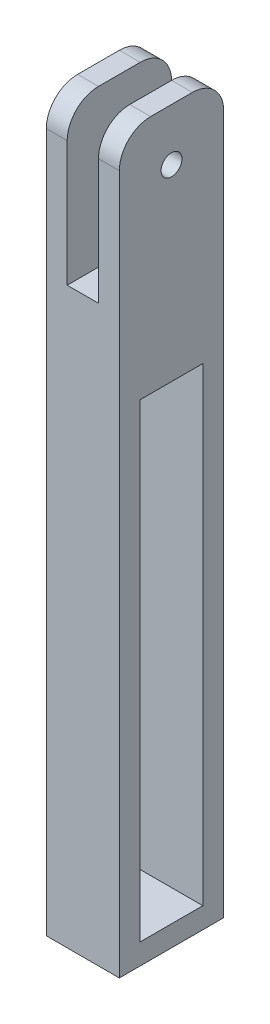
ISO-10303-21;
HEADER;
FILE_DESCRIPTION(('STEP AP214'),'2;1');
FILE_NAME('part.step','',(''),(''),'','','');
FILE_SCHEMA(('AUTOMOTIVE_DESIGN { 1 0 10303 214 1 1 1 1 }'));
ENDSEC;
DATA;
#1=APPLICATION_CONTEXT('core data for automotive mechanical design processes');
#2=APPLICATION_PROTOCOL_DEFINITION('international standard','automotive_design',2000,#1);
#3=PRODUCT_CONTEXT('',#1,'mechanical');
#4=PRODUCT('Part','Part','',(#3));
#5=PRODUCT_RELATED_PRODUCT_CATEGORY('part','',(#4));
#6=PRODUCT_DEFINITION_FORMATION('','',#4);
#7=PRODUCT_DEFINITION_CONTEXT('part definition',#1,'design');
#8=PRODUCT_DEFINITION('design','',#6,#7);
#9=PRODUCT_DEFINITION_SHAPE('','',#8);
#10=(LENGTH_UNIT() NAMED_UNIT(*) SI_UNIT(.MILLI.,.METRE.));
#11=(NAMED_UNIT(*) PLANE_ANGLE_UNIT() SI_UNIT($,.RADIAN.));
#12=(NAMED_UNIT(*) SI_UNIT($,.STERADIAN.) SOLID_ANGLE_UNIT());
#13=UNCERTAINTY_MEASURE_WITH_UNIT(LENGTH_MEASURE(1.E-05),#10,'distance_accuracy_value','');
#14=(GEOMETRIC_REPRESENTATION_CONTEXT(3) GLOBAL_UNCERTAINTY_ASSIGNED_CONTEXT((#13)) GLOBAL_UNIT_ASSIGNED_CONTEXT((#10,
#11,#12)) REPRESENTATION_CONTEXT('',''));
#15=CARTESIAN_POINT('',(0.,0.,0.));
#16=DIRECTION('',(0.,0.,1.));
#17=DIRECTION('',(1.,0.,0.));
#18=AXIS2_PLACEMENT_3D('',#15,#16,#17);
#19=CARTESIAN_POINT('',(0.,350.,0.));
#20=DIRECTION('',(0.,-1.,0.));
#21=DIRECTION('',(0.,0.,-1.));
#22=AXIS2_PLACEMENT_3D('',#19,#20,#21);
#23=PLANE('',#22);
#24=DIRECTION('',(1.,0.,0.));
#25=VECTOR('',#24,1.);
#26=CARTESIAN_POINT('',(-315.,350.,-15.0000000000002));
#27=LINE('',#26,#25);
#28=CARTESIAN_POINT('',(0.,350.,-15.0000000000001));
#29=VERTEX_POINT('',#28);
#30=CARTESIAN_POINT('',(9.99999999999999,350.,-15.));
#31=VERTEX_POINT('',#30);
#32=EDGE_CURVE('E273',#29,#31,#27,.T.);
#33=ORIENTED_EDGE('',*,*,#32,.T.);
#34=DIRECTION('',(0.,0.,1.));
#35=VECTOR('',#34,1.);
#36=CARTESIAN_POINT('',(9.99999999999999,350.,-350.));
#37=LINE('',#36,#35);
#38=CARTESIAN_POINT('',(9.99999999999999,350.,-35.));
#39=VERTEX_POINT('',#38);
#40=EDGE_CURVE('E180',#39,#31,#37,.T.);
#41=ORIENTED_EDGE('',*,*,#40,.F.);
#42=DIRECTION('',(1.,0.,0.));
#43=VECTOR('',#42,1.);
#44=CARTESIAN_POINT('',(-315.,350.,-35.0000000000002));
#45=LINE('',#44,#43);
#46=CARTESIAN_POINT('',(0.,350.,-35.));
#47=VERTEX_POINT('',#46);
#48=EDGE_CURVE('E269',#47,#39,#45,.T.);
#49=ORIENTED_EDGE('',*,*,#48,.F.);
#50=DIRECTION('',(0.,0.,1.));
#51=VECTOR('',#50,1.);
#52=CARTESIAN_POINT('',(0.,350.,0.));
#53=LINE('',#52,#51);
#54=EDGE_CURVE('E243',#47,#29,#53,.T.);
#55=ORIENTED_EDGE('',*,*,#54,.T.);
#56=EDGE_LOOP('',(#33,#41,#49,#55));
#57=FACE_BOUND('',#56,.T.);
#58=ADVANCED_FACE('F41',(#57),#23,.F.);
#59=CARTESIAN_POINT('',(-315.,335.,-35.0000000000002));
#60=DIRECTION('',(1.,0.,0.));
#61=DIRECTION('',(0.,0.,-1.));
#62=AXIS2_PLACEMENT_3D('',#59,#60,#61);
#63=CYLINDRICAL_SURFACE('',#62,15.);
#64=CARTESIAN_POINT('',(10.,335.,-35.));
#65=DIRECTION('',(-1.,0.,0.));
#66=DIRECTION('',(0.,-1.,0.));
#67=AXIS2_PLACEMENT_3D('',#64,#65,#66);
#68=CIRCLE('',#67,15.);
#69=CARTESIAN_POINT('',(10.,335.,-50.));
#70=VERTEX_POINT('',#69);
#71=EDGE_CURVE('E191',#70,#39,#68,.F.);
#72=ORIENTED_EDGE('',*,*,#71,.F.);
#73=DIRECTION('',(1.,0.,0.));
#74=VECTOR('',#73,1.);
#75=CARTESIAN_POINT('',(-315.,335.,-50.0000000000002));
#76=LINE('',#75,#74);
#77=CARTESIAN_POINT('',(0.,335.,-50.));
#78=VERTEX_POINT('',#77);
#79=EDGE_CURVE('E230',#78,#70,#76,.T.);
#80=ORIENTED_EDGE('',*,*,#79,.F.);
#81=CARTESIAN_POINT('',(0.,335.,-35.));
#82=DIRECTION('',(1.,0.,0.));
#83=DIRECTION('',(0.,0.,-1.));
#84=AXIS2_PLACEMENT_3D('',#81,#82,#83);
#85=CIRCLE('',#84,15.);
#86=EDGE_CURVE('E233',#78,#47,#85,.T.);
#87=ORIENTED_EDGE('',*,*,#86,.T.);
#88=ORIENTED_EDGE('',*,*,#48,.T.);
#89=EDGE_LOOP('',(#72,#80,#87,#88));
#90=FACE_BOUND('',#89,.T.);
#91=ADVANCED_FACE('F302',(#90),#63,.T.);
#92=CARTESIAN_POINT('',(-315.,335.,-15.0000000000002));
#93=DIRECTION('',(1.,0.,0.));
#94=DIRECTION('',(0.,0.,-1.));
#95=AXIS2_PLACEMENT_3D('',#92,#93,#94);
#96=CYLINDRICAL_SURFACE('',#95,15.);
#97=CARTESIAN_POINT('',(10.,335.,-15.));
#98=DIRECTION('',(-1.,0.,0.));
#99=DIRECTION('',(0.,-1.,0.));
#100=AXIS2_PLACEMENT_3D('',#97,#98,#99);
#101=CIRCLE('',#100,15.);
#102=CARTESIAN_POINT('',(9.99999999999999,335.,0.));
#103=VERTEX_POINT('',#102);
#104=EDGE_CURVE('E50',#31,#103,#101,.F.);
#105=ORIENTED_EDGE('',*,*,#104,.F.);
#106=ORIENTED_EDGE('',*,*,#32,.F.);
#107=CARTESIAN_POINT('',(0.,335.,-15.));
#108=DIRECTION('',(1.,0.,0.));
#109=DIRECTION('',(0.,0.,-1.));
#110=AXIS2_PLACEMENT_3D('',#107,#108,#109);
#111=CIRCLE('',#110,15.);
#112=CARTESIAN_POINT('',(0.,335.,0.));
#113=VERTEX_POINT('',#112);
#114=EDGE_CURVE('E240',#29,#113,#111,.T.);
#115=ORIENTED_EDGE('',*,*,#114,.T.);
#116=DIRECTION('',(1.,0.,0.));
#117=VECTOR('',#116,1.);
#118=CARTESIAN_POINT('',(-315.,335.,-1.94289029309402E-13));
#119=LINE('',#118,#117);
#120=EDGE_CURVE('E231',#113,#103,#119,.T.);
#121=ORIENTED_EDGE('',*,*,#120,.T.);
#122=EDGE_LOOP('',(#105,#106,#115,#121));
#123=FACE_BOUND('',#122,.T.);
#124=ADVANCED_FACE('F311',(#123),#96,.T.);
#125=CARTESIAN_POINT('',(0.,350.,0.));
#126=DIRECTION('',(1.,0.,0.));
#127=DIRECTION('',(0.,0.,-1.));
#128=AXIS2_PLACEMENT_3D('',#125,#126,#127);
#129=PLANE('',#128);
#130=CARTESIAN_POINT('',(0.,325.,-25.));
#131=DIRECTION('',(-1.,0.,0.));
#132=DIRECTION('',(0.,0.,1.));
#133=AXIS2_PLACEMENT_3D('',#130,#131,#132);
#134=CIRCLE('',#133,5.);
#135=CARTESIAN_POINT('',(0.,325.,-20.));
#136=VERTEX_POINT('',#135);
#137=EDGE_CURVE('E383',#136,#136,#134,.T.);
#138=ORIENTED_EDGE('',*,*,#137,.F.);
#139=EDGE_LOOP('',(#138));
#140=FACE_BOUND('',#139,.T.);
#141=DIRECTION('',(0.,0.,-1.));
#142=VECTOR('',#141,1.);
#143=CARTESIAN_POINT('',(0.,10.,0.));
#144=LINE('',#143,#142);
#145=CARTESIAN_POINT('',(0.,10.,-10.));
#146=VERTEX_POINT('',#145);
#147=CARTESIAN_POINT('',(0.,10.,-40.));
#148=VERTEX_POINT('',#147);
#149=EDGE_CURVE('E219',#146,#148,#144,.T.);
#150=ORIENTED_EDGE('',*,*,#149,.T.);
#151=DIRECTION('',(0.,1.,0.));
#152=VECTOR('',#151,1.);
#153=CARTESIAN_POINT('',(0.,350.,-40.));
#154=LINE('',#153,#152);
#155=CARTESIAN_POINT('',(0.,235.,-40.));
#156=VERTEX_POINT('',#155);
#157=EDGE_CURVE('E222',#148,#156,#154,.T.);
#158=ORIENTED_EDGE('',*,*,#157,.T.);
#159=DIRECTION('',(0.,0.,1.));
#160=VECTOR('',#159,1.);
#161=CARTESIAN_POINT('',(0.,235.,0.));
#162=LINE('',#161,#160);
#163=CARTESIAN_POINT('',(0.,235.,-9.99999999999999));
#164=VERTEX_POINT('',#163);
#165=EDGE_CURVE('E208',#156,#164,#162,.T.);
#166=ORIENTED_EDGE('',*,*,#165,.T.);
#167=DIRECTION('',(0.,-1.,0.));
#168=VECTOR('',#167,1.);
#169=CARTESIAN_POINT('',(0.,350.,-9.99999999999999));
#170=LINE('',#169,#168);
#171=EDGE_CURVE('E216',#164,#146,#170,.T.);
#172=ORIENTED_EDGE('',*,*,#171,.T.);
#173=EDGE_LOOP('',(#150,#158,#166,#172));
#174=FACE_BOUND('',#173,.T.);
#175=ORIENTED_EDGE('',*,*,#114,.F.);
#176=ORIENTED_EDGE('',*,*,#54,.F.);
#177=ORIENTED_EDGE('',*,*,#86,.F.);
#178=DIRECTION('',(0.,-1.,0.));
#179=VECTOR('',#178,1.);
#180=CARTESIAN_POINT('',(0.,350.,-50.));
#181=LINE('',#180,#179);
#182=CARTESIAN_POINT('',(0.,0.,-50.));
#183=VERTEX_POINT('',#182);
#184=EDGE_CURVE('E250',#78,#183,#181,.T.);
#185=ORIENTED_EDGE('',*,*,#184,.T.);
#186=DIRECTION('',(0.,0.,1.));
#187=VECTOR('',#186,1.);
#188=CARTESIAN_POINT('',(0.,0.,0.));
#189=LINE('',#188,#187);
#190=CARTESIAN_POINT('',(0.,0.,0.));
#191=VERTEX_POINT('',#190);
#192=EDGE_CURVE('E242',#183,#191,#189,.T.);
#193=ORIENTED_EDGE('',*,*,#192,.T.);
#194=DIRECTION('',(0.,-1.,0.));
#195=VECTOR('',#194,1.);
#196=CARTESIAN_POINT('',(0.,350.,0.));
#197=LINE('',#196,#195);
#198=EDGE_CURVE('E266',#113,#191,#197,.T.);
#199=ORIENTED_EDGE('',*,*,#198,.F.);
#200=EDGE_LOOP('',(#175,#176,#177,#185,#193,#199));
#201=FACE_BOUND('',#200,.T.);
#202=ADVANCED_FACE('F43',(#140,#174,#201),#129,.F.);
#203=CARTESIAN_POINT('',(0.,350.,0.));
#204=DIRECTION('',(0.,0.,-1.));
#205=DIRECTION('',(-1.,0.,0.));
#206=AXIS2_PLACEMENT_3D('',#203,#204,#205);
#207=PLANE('',#206);
#208=DIRECTION('',(1.,0.,0.));
#209=VECTOR('',#208,1.);
#210=CARTESIAN_POINT('',(9.99999999999999,275.,0.));
#211=LINE('',#210,#209);
#212=CARTESIAN_POINT('',(9.99999999999999,275.,0.));
#213=VERTEX_POINT('',#212);
#214=CARTESIAN_POINT('',(25.,275.,0.));
#215=VERTEX_POINT('',#214);
#216=EDGE_CURVE('E160',#213,#215,#211,.T.);
#217=ORIENTED_EDGE('',*,*,#216,.F.);
#218=DIRECTION('',(0.,-1.,0.));
#219=VECTOR('',#218,1.);
#220=CARTESIAN_POINT('',(9.99999999999999,350.,0.));
#221=LINE('',#220,#219);
#222=EDGE_CURVE('E166',#103,#213,#221,.T.);
#223=ORIENTED_EDGE('',*,*,#222,.F.);
#224=ORIENTED_EDGE('',*,*,#120,.F.);
#225=ORIENTED_EDGE('',*,*,#198,.T.);
#226=DIRECTION('',(1.,0.,0.));
#227=VECTOR('',#226,1.);
#228=CARTESIAN_POINT('',(0.,0.,0.));
#229=LINE('',#228,#227);
#230=CARTESIAN_POINT('',(35.,0.,0.));
#231=VERTEX_POINT('',#230);
#232=EDGE_CURVE('E253',#191,#231,#229,.T.);
#233=ORIENTED_EDGE('',*,*,#232,.T.);
#234=DIRECTION('',(0.,-1.,0.));
#235=VECTOR('',#234,1.);
#236=CARTESIAN_POINT('',(35.,350.,0.));
#237=LINE('',#236,#235);
#238=CARTESIAN_POINT('',(35.,335.,0.));
#239=VERTEX_POINT('',#238);
#240=EDGE_CURVE('E264',#239,#231,#237,.T.);
#241=ORIENTED_EDGE('',*,*,#240,.F.);
#242=CARTESIAN_POINT('',(25.,335.,0.));
#243=VERTEX_POINT('',#242);
#244=EDGE_CURVE('E229',#243,#239,#119,.T.);
#245=ORIENTED_EDGE('',*,*,#244,.F.);
#246=DIRECTION('',(0.,1.,0.));
#247=VECTOR('',#246,1.);
#248=CARTESIAN_POINT('',(25.,275.,0.));
#249=LINE('',#248,#247);
#250=EDGE_CURVE('E57',#215,#243,#249,.T.);
#251=ORIENTED_EDGE('',*,*,#250,.F.);
#252=EDGE_LOOP('',(#217,#223,#224,#225,#233,#241,#245,#251));
#253=FACE_BOUND('',#252,.T.);
#254=ADVANCED_FACE('F174',(#253),#207,.F.);
#255=CARTESIAN_POINT('',(35.,350.,0.));
#256=DIRECTION('',(-1.,0.,0.));
#257=DIRECTION('',(0.,0.,1.));
#258=AXIS2_PLACEMENT_3D('',#255,#256,#257);
#259=PLANE('',#258);
#260=CARTESIAN_POINT('',(35.,325.,-25.));
#261=DIRECTION('',(-1.,0.,0.));
#262=DIRECTION('',(0.,0.,1.));
#263=AXIS2_PLACEMENT_3D('',#260,#261,#262);
#264=CIRCLE('',#263,5.);
#265=CARTESIAN_POINT('',(35.,325.,-20.));
#266=VERTEX_POINT('',#265);
#267=EDGE_CURVE('E343',#266,#266,#264,.T.);
#268=ORIENTED_EDGE('',*,*,#267,.T.);
#269=EDGE_LOOP('',(#268));
#270=FACE_BOUND('',#269,.T.);
#271=DIRECTION('',(0.,0.,1.));
#272=VECTOR('',#271,1.);
#273=CARTESIAN_POINT('',(35.,235.,-9.99999999999999));
#274=LINE('',#273,#272);
#275=CARTESIAN_POINT('',(35.,235.,-40.0000000000002));
#276=VERTEX_POINT('',#275);
#277=CARTESIAN_POINT('',(35.,235.,-9.99999999999999));
#278=VERTEX_POINT('',#277);
#279=EDGE_CURVE('E197',#276,#278,#274,.T.);
#280=ORIENTED_EDGE('',*,*,#279,.F.);
#281=DIRECTION('',(0.,1.,0.));
#282=VECTOR('',#281,1.);
#283=CARTESIAN_POINT('',(35.,235.,-40.));
#284=LINE('',#283,#282);
#285=CARTESIAN_POINT('',(35.,10.,-40.));
#286=VERTEX_POINT('',#285);
#287=EDGE_CURVE('E195',#286,#276,#284,.T.);
#288=ORIENTED_EDGE('',*,*,#287,.F.);
#289=DIRECTION('',(0.,0.,-1.));
#290=VECTOR('',#289,1.);
#291=CARTESIAN_POINT('',(35.,10.,-10.));
#292=LINE('',#291,#290);
#293=CARTESIAN_POINT('',(35.,10.,-10.));
#294=VERTEX_POINT('',#293);
#295=EDGE_CURVE('E202',#294,#286,#292,.T.);
#296=ORIENTED_EDGE('',*,*,#295,.F.);
#297=DIRECTION('',(0.,-1.,0.));
#298=VECTOR('',#297,1.);
#299=CARTESIAN_POINT('',(35.,235.,-9.99999999999999));
#300=LINE('',#299,#298);
#301=EDGE_CURVE('E199',#278,#294,#300,.T.);
#302=ORIENTED_EDGE('',*,*,#301,.F.);
#303=EDGE_LOOP('',(#280,#288,#296,#302));
#304=FACE_BOUND('',#303,.T.);
#305=CARTESIAN_POINT('',(35.,335.,-15.));
#306=DIRECTION('',(1.,0.,0.));
#307=DIRECTION('',(0.,0.,-1.));
#308=AXIS2_PLACEMENT_3D('',#305,#306,#307);
#309=CIRCLE('',#308,15.);
#310=CARTESIAN_POINT('',(35.,350.,-15.0000000000001));
#311=VERTEX_POINT('',#310);
#312=EDGE_CURVE('E226',#311,#239,#309,.T.);
#313=ORIENTED_EDGE('',*,*,#312,.T.);
#314=ORIENTED_EDGE('',*,*,#240,.T.);
#315=DIRECTION('',(0.,0.,-1.));
#316=VECTOR('',#315,1.);
#317=CARTESIAN_POINT('',(35.,0.,0.));
#318=LINE('',#317,#316);
#319=CARTESIAN_POINT('',(35.,0.,-50.));
#320=VERTEX_POINT('',#319);
#321=EDGE_CURVE('E256',#231,#320,#318,.T.);
#322=ORIENTED_EDGE('',*,*,#321,.T.);
#323=DIRECTION('',(0.,-1.,0.));
#324=VECTOR('',#323,1.);
#325=CARTESIAN_POINT('',(35.,350.,-50.));
#326=LINE('',#325,#324);
#327=CARTESIAN_POINT('',(35.,335.,-50.));
#328=VERTEX_POINT('',#327);
#329=EDGE_CURVE('E262',#328,#320,#326,.T.);
#330=ORIENTED_EDGE('',*,*,#329,.F.);
#331=CARTESIAN_POINT('',(35.,335.,-35.));
#332=DIRECTION('',(1.,0.,0.));
#333=DIRECTION('',(0.,0.,-1.));
#334=AXIS2_PLACEMENT_3D('',#331,#332,#333);
#335=CIRCLE('',#334,15.);
#336=CARTESIAN_POINT('',(35.,350.,-34.9999999999999));
#337=VERTEX_POINT('',#336);
#338=EDGE_CURVE('E225',#328,#337,#335,.T.);
#339=ORIENTED_EDGE('',*,*,#338,.T.);
#340=DIRECTION('',(0.,0.,-1.));
#341=VECTOR('',#340,1.);
#342=CARTESIAN_POINT('',(35.,350.,0.));
#343=LINE('',#342,#341);
#344=EDGE_CURVE('E246',#311,#337,#343,.T.);
#345=ORIENTED_EDGE('',*,*,#344,.F.);
#346=EDGE_LOOP('',(#313,#314,#322,#330,#339,#345));
#347=FACE_BOUND('',#346,.T.);
#348=ADVANCED_FACE('F290',(#270,#304,#347),#259,.F.);
#349=CARTESIAN_POINT('',(25.,350.,-35.));
#350=VERTEX_POINT('',#349);
#351=EDGE_CURVE('E268',#350,#337,#45,.T.);
#352=ORIENTED_EDGE('',*,*,#351,.F.);
#353=DIRECTION('',(0.,0.,1.));
#354=VECTOR('',#353,1.);
#355=CARTESIAN_POINT('',(25.,350.,-350.));
#356=LINE('',#355,#354);
#357=CARTESIAN_POINT('',(25.,350.,-15.));
#358=VERTEX_POINT('',#357);
#359=EDGE_CURVE('E183',#350,#358,#356,.T.);
#360=ORIENTED_EDGE('',*,*,#359,.T.);
#361=EDGE_CURVE('E272',#358,#311,#27,.T.);
#362=ORIENTED_EDGE('',*,*,#361,.T.);
#363=ORIENTED_EDGE('',*,*,#344,.T.);
#364=EDGE_LOOP('',(#352,#360,#362,#363));
#365=FACE_BOUND('',#364,.T.);
#366=ADVANCED_FACE('F284',(#365),#23,.F.);
#367=CARTESIAN_POINT('',(0.,350.,-50.));
#368=DIRECTION('',(0.,0.,1.));
#369=DIRECTION('',(1.,0.,0.));
#370=AXIS2_PLACEMENT_3D('',#367,#368,#369);
#371=PLANE('',#370);
#372=ORIENTED_EDGE('',*,*,#79,.T.);
#373=DIRECTION('',(0.,-1.,0.));
#374=VECTOR('',#373,1.);
#375=CARTESIAN_POINT('',(9.99999999999999,350.,-50.));
#376=LINE('',#375,#374);
#377=CARTESIAN_POINT('',(9.99999999999999,275.,-50.));
#378=VERTEX_POINT('',#377);
#379=EDGE_CURVE('E193',#70,#378,#376,.T.);
#380=ORIENTED_EDGE('',*,*,#379,.T.);
#381=DIRECTION('',(1.,0.,0.));
#382=VECTOR('',#381,1.);
#383=CARTESIAN_POINT('',(0.,275.,-50.));
#384=LINE('',#383,#382);
#385=CARTESIAN_POINT('',(25.,275.,-50.));
#386=VERTEX_POINT('',#385);
#387=EDGE_CURVE('E11',#378,#386,#384,.T.);
#388=ORIENTED_EDGE('',*,*,#387,.T.);
#389=DIRECTION('',(0.,1.,0.));
#390=VECTOR('',#389,1.);
#391=CARTESIAN_POINT('',(25.,350.,-50.));
#392=LINE('',#391,#390);
#393=CARTESIAN_POINT('',(25.,335.,-50.));
#394=VERTEX_POINT('',#393);
#395=EDGE_CURVE('E188',#386,#394,#392,.T.);
#396=ORIENTED_EDGE('',*,*,#395,.T.);
#397=EDGE_CURVE('E236',#394,#328,#76,.T.);
#398=ORIENTED_EDGE('',*,*,#397,.T.);
#399=ORIENTED_EDGE('',*,*,#329,.T.);
#400=DIRECTION('',(-1.,0.,0.));
#401=VECTOR('',#400,1.);
#402=CARTESIAN_POINT('',(0.,0.,-50.));
#403=LINE('',#402,#401);
#404=EDGE_CURVE('E247',#320,#183,#403,.T.);
#405=ORIENTED_EDGE('',*,*,#404,.T.);
#406=ORIENTED_EDGE('',*,*,#184,.F.);
#407=EDGE_LOOP('',(#372,#380,#388,#396,#398,#399,#405,#406));
#408=FACE_BOUND('',#407,.T.);
#409=ADVANCED_FACE('F297',(#408),#371,.F.);
#410=CARTESIAN_POINT('',(0.,0.,0.));
#411=DIRECTION('',(0.,-1.,0.));
#412=DIRECTION('',(0.,0.,-1.));
#413=AXIS2_PLACEMENT_3D('',#410,#411,#412);
#414=PLANE('',#413);
#415=ORIENTED_EDGE('',*,*,#192,.F.);
#416=ORIENTED_EDGE('',*,*,#404,.F.);
#417=ORIENTED_EDGE('',*,*,#321,.F.);
#418=ORIENTED_EDGE('',*,*,#232,.F.);
#419=EDGE_LOOP('',(#415,#416,#417,#418));
#420=FACE_BOUND('',#419,.T.);
#421=ADVANCED_FACE('F316',(#420),#414,.T.);
#422=CARTESIAN_POINT('',(25.,335.,-35.));
#423=DIRECTION('',(1.,0.,0.));
#424=DIRECTION('',(0.,1.,0.));
#425=AXIS2_PLACEMENT_3D('',#422,#423,#424);
#426=CIRCLE('',#425,15.);
#427=EDGE_CURVE('E182',#350,#394,#426,.F.);
#428=ORIENTED_EDGE('',*,*,#427,.F.);
#429=ORIENTED_EDGE('',*,*,#351,.T.);
#430=ORIENTED_EDGE('',*,*,#338,.F.);
#431=ORIENTED_EDGE('',*,*,#397,.F.);
#432=EDGE_LOOP('',(#428,#429,#430,#431));
#433=FACE_BOUND('',#432,.T.);
#434=ADVANCED_FACE('F295',(#433),#63,.T.);
#435=CARTESIAN_POINT('',(25.,335.,-15.));
#436=DIRECTION('',(1.,0.,0.));
#437=DIRECTION('',(0.,1.,0.));
#438=AXIS2_PLACEMENT_3D('',#435,#436,#437);
#439=CIRCLE('',#438,15.);
#440=EDGE_CURVE('E276',#243,#358,#439,.F.);
#441=ORIENTED_EDGE('',*,*,#440,.F.);
#442=ORIENTED_EDGE('',*,*,#244,.T.);
#443=ORIENTED_EDGE('',*,*,#312,.F.);
#444=ORIENTED_EDGE('',*,*,#361,.F.);
#445=EDGE_LOOP('',(#441,#442,#443,#444));
#446=FACE_BOUND('',#445,.T.);
#447=ADVANCED_FACE('F286',(#446),#96,.T.);
#448=CARTESIAN_POINT('',(-315.,235.,-40.0000000000002));
#449=DIRECTION('',(0.,0.,-1.));
#450=DIRECTION('',(-1.,0.,0.));
#451=AXIS2_PLACEMENT_3D('',#448,#449,#450);
#452=PLANE('',#451);
#453=DIRECTION('',(1.,0.,0.));
#454=VECTOR('',#453,1.);
#455=CARTESIAN_POINT('',(-315.,10.,-40.0000000000002));
#456=LINE('',#455,#454);
#457=EDGE_CURVE('E206',#148,#286,#456,.T.);
#458=ORIENTED_EDGE('',*,*,#457,.T.);
#459=ORIENTED_EDGE('',*,*,#287,.T.);
#460=DIRECTION('',(1.,0.,0.));
#461=VECTOR('',#460,1.);
#462=CARTESIAN_POINT('',(-315.,235.,-40.0000000000002));
#463=LINE('',#462,#461);
#464=EDGE_CURVE('E205',#156,#276,#463,.T.);
#465=ORIENTED_EDGE('',*,*,#464,.F.);
#466=ORIENTED_EDGE('',*,*,#157,.F.);
#467=EDGE_LOOP('',(#458,#459,#465,#466));
#468=FACE_BOUND('',#467,.T.);
#469=ADVANCED_FACE('F351',(#468),#452,.F.);
#470=CARTESIAN_POINT('',(-315.,10.,-10.0000000000002));
#471=DIRECTION('',(0.,-1.,0.));
#472=DIRECTION('',(0.,0.,-1.));
#473=AXIS2_PLACEMENT_3D('',#470,#471,#472);
#474=PLANE('',#473);
#475=DIRECTION('',(1.,0.,0.));
#476=VECTOR('',#475,1.);
#477=CARTESIAN_POINT('',(-315.,10.,-10.0000000000002));
#478=LINE('',#477,#476);
#479=EDGE_CURVE('E209',#146,#294,#478,.T.);
#480=ORIENTED_EDGE('',*,*,#479,.T.);
#481=ORIENTED_EDGE('',*,*,#295,.T.);
#482=ORIENTED_EDGE('',*,*,#457,.F.);
#483=ORIENTED_EDGE('',*,*,#149,.F.);
#484=EDGE_LOOP('',(#480,#481,#482,#483));
#485=FACE_BOUND('',#484,.T.);
#486=ADVANCED_FACE('F356',(#485),#474,.F.);
#487=CARTESIAN_POINT('',(-315.,235.,-10.0000000000002));
#488=DIRECTION('',(0.,0.,1.));
#489=DIRECTION('',(1.,0.,0.));
#490=AXIS2_PLACEMENT_3D('',#487,#488,#489);
#491=PLANE('',#490);
#492=DIRECTION('',(1.,0.,0.));
#493=VECTOR('',#492,1.);
#494=CARTESIAN_POINT('',(-315.,235.,-10.0000000000002));
#495=LINE('',#494,#493);
#496=EDGE_CURVE('E65',#164,#278,#495,.T.);
#497=ORIENTED_EDGE('',*,*,#496,.T.);
#498=ORIENTED_EDGE('',*,*,#301,.T.);
#499=ORIENTED_EDGE('',*,*,#479,.F.);
#500=ORIENTED_EDGE('',*,*,#171,.F.);
#501=EDGE_LOOP('',(#497,#498,#499,#500));
#502=FACE_BOUND('',#501,.T.);
#503=ADVANCED_FACE('F358',(#502),#491,.F.);
#504=CARTESIAN_POINT('',(-315.,235.,-10.0000000000002));
#505=DIRECTION('',(0.,1.,0.));
#506=DIRECTION('',(0.,0.,1.));
#507=AXIS2_PLACEMENT_3D('',#504,#505,#506);
#508=PLANE('',#507);
#509=ORIENTED_EDGE('',*,*,#464,.T.);
#510=ORIENTED_EDGE('',*,*,#279,.T.);
#511=ORIENTED_EDGE('',*,*,#496,.F.);
#512=ORIENTED_EDGE('',*,*,#165,.F.);
#513=EDGE_LOOP('',(#509,#510,#511,#512));
#514=FACE_BOUND('',#513,.T.);
#515=ADVANCED_FACE('F348',(#514),#508,.F.);
#516=CARTESIAN_POINT('',(9.99999999999999,275.,-350.));
#517=DIRECTION('',(0.,-1.,0.));
#518=DIRECTION('',(0.,0.,-1.));
#519=AXIS2_PLACEMENT_3D('',#516,#517,#518);
#520=PLANE('',#519);
#521=DIRECTION('',(0.,0.,1.));
#522=VECTOR('',#521,1.);
#523=CARTESIAN_POINT('',(9.99999999999999,275.,-350.));
#524=LINE('',#523,#522);
#525=EDGE_CURVE('E155',#378,#213,#524,.T.);
#526=ORIENTED_EDGE('',*,*,#525,.T.);
#527=ORIENTED_EDGE('',*,*,#216,.T.);
#528=DIRECTION('',(0.,0.,1.));
#529=VECTOR('',#528,1.);
#530=CARTESIAN_POINT('',(25.,275.,-350.));
#531=LINE('',#530,#529);
#532=EDGE_CURVE('E163',#386,#215,#531,.T.);
#533=ORIENTED_EDGE('',*,*,#532,.F.);
#534=ORIENTED_EDGE('',*,*,#387,.F.);
#535=EDGE_LOOP('',(#526,#527,#533,#534));
#536=FACE_BOUND('',#535,.T.);
#537=ADVANCED_FACE('F157',(#536),#520,.F.);
#538=CARTESIAN_POINT('',(9.99999999999999,350.,-350.));
#539=DIRECTION('',(-1.,0.,0.));
#540=DIRECTION('',(0.,-1.,0.));
#541=AXIS2_PLACEMENT_3D('',#538,#539,#540);
#542=PLANE('',#541);
#543=CARTESIAN_POINT('',(9.99999999999999,325.,-25.));
#544=DIRECTION('',(-1.,0.,0.));
#545=DIRECTION('',(0.,-1.,0.));
#546=AXIS2_PLACEMENT_3D('',#543,#544,#545);
#547=CIRCLE('',#546,5.);
#548=CARTESIAN_POINT('',(9.99999999999999,320.,-25.));
#549=VERTEX_POINT('',#548);
#550=EDGE_CURVE('E172',#549,#549,#547,.T.);
#551=ORIENTED_EDGE('',*,*,#550,.T.);
#552=EDGE_LOOP('',(#551));
#553=FACE_BOUND('',#552,.T.);
#554=ORIENTED_EDGE('',*,*,#71,.T.);
#555=ORIENTED_EDGE('',*,*,#40,.T.);
#556=ORIENTED_EDGE('',*,*,#104,.T.);
#557=ORIENTED_EDGE('',*,*,#222,.T.);
#558=ORIENTED_EDGE('',*,*,#525,.F.);
#559=ORIENTED_EDGE('',*,*,#379,.F.);
#560=EDGE_LOOP('',(#554,#555,#556,#557,#558,#559));
#561=FACE_BOUND('',#560,.T.);
#562=ADVANCED_FACE('F167',(#553,#561),#542,.F.);
#563=CARTESIAN_POINT('',(25.,275.,-350.));
#564=DIRECTION('',(1.,0.,0.));
#565=DIRECTION('',(0.,1.,0.));
#566=AXIS2_PLACEMENT_3D('',#563,#564,#565);
#567=PLANE('',#566);
#568=CARTESIAN_POINT('',(25.,325.,-25.));
#569=DIRECTION('',(1.,0.,0.));
#570=DIRECTION('',(0.,1.,0.));
#571=AXIS2_PLACEMENT_3D('',#568,#569,#570);
#572=CIRCLE('',#571,5.);
#573=CARTESIAN_POINT('',(25.,330.,-25.));
#574=VERTEX_POINT('',#573);
#575=EDGE_CURVE('E45',#574,#574,#572,.T.);
#576=ORIENTED_EDGE('',*,*,#575,.T.);
#577=EDGE_LOOP('',(#576));
#578=FACE_BOUND('',#577,.T.);
#579=ORIENTED_EDGE('',*,*,#532,.T.);
#580=ORIENTED_EDGE('',*,*,#250,.T.);
#581=ORIENTED_EDGE('',*,*,#440,.T.);
#582=ORIENTED_EDGE('',*,*,#359,.F.);
#583=ORIENTED_EDGE('',*,*,#427,.T.);
#584=ORIENTED_EDGE('',*,*,#395,.F.);
#585=EDGE_LOOP('',(#579,#580,#581,#582,#583,#584));
#586=FACE_BOUND('',#585,.T.);
#587=ADVANCED_FACE('F278',(#578,#586),#567,.F.);
#588=CARTESIAN_POINT('',(35.,325.,-25.));
#589=DIRECTION('',(-1.,0.,0.));
#590=DIRECTION('',(0.,0.,1.));
#591=AXIS2_PLACEMENT_3D('',#588,#589,#590);
#592=CYLINDRICAL_SURFACE('',#591,5.);
#593=ORIENTED_EDGE('',*,*,#267,.F.);
#594=EDGE_LOOP('',(#593));
#595=FACE_BOUND('',#594,.T.);
#596=ORIENTED_EDGE('',*,*,#575,.F.);
#597=EDGE_LOOP('',(#596));
#598=FACE_BOUND('',#597,.T.);
#599=ADVANCED_FACE('F394',(#595,#598),#592,.F.);
#600=ORIENTED_EDGE('',*,*,#137,.T.);
#601=EDGE_LOOP('',(#600));
#602=FACE_BOUND('',#601,.T.);
#603=ORIENTED_EDGE('',*,*,#550,.F.);
#604=EDGE_LOOP('',(#603));
#605=FACE_BOUND('',#604,.T.);
#606=ADVANCED_FACE('F396',(#602,#605),#592,.F.);
#607=CLOSED_SHELL('',(#58,#91,#124,#202,#254,#348,#366,#409,#421,#434,#447,#469,#486,#503,#515,
#537,#562,#587,#599,#606));
#608=MANIFOLD_SOLID_BREP('B2',#607);
#609=ADVANCED_BREP_SHAPE_REPRESENTATION('',(#18,#608),#14);
#610=SHAPE_DEFINITION_REPRESENTATION(#9,#609);
ENDSEC;
END-ISO-10303-21;
